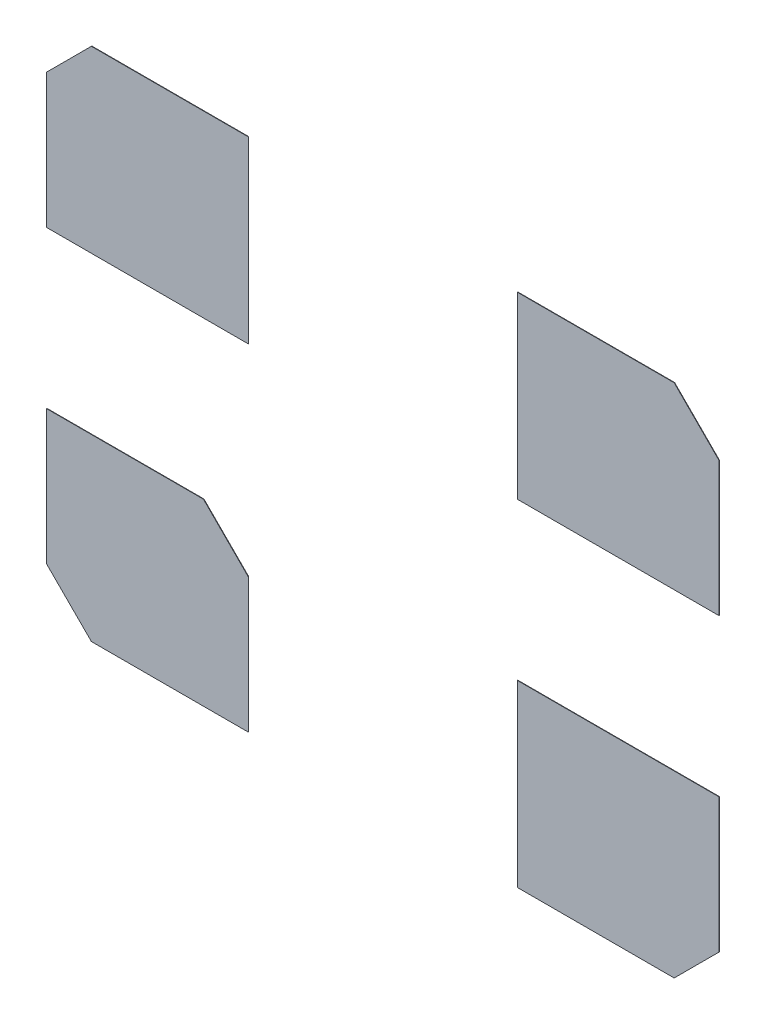
ISO-10303-21;
HEADER;
FILE_DESCRIPTION(('STEP AP214'),'2;1');
FILE_NAME('part.step','',(''),(''),'','','');
FILE_SCHEMA(('AUTOMOTIVE_DESIGN { 1 0 10303 214 1 1 1 1 }'));
ENDSEC;
DATA;
#1=APPLICATION_CONTEXT('core data for automotive mechanical design processes');
#2=APPLICATION_PROTOCOL_DEFINITION('international standard','automotive_design',2000,#1);
#3=PRODUCT_CONTEXT('',#1,'mechanical');
#4=PRODUCT('Part','Part','',(#3));
#5=PRODUCT_RELATED_PRODUCT_CATEGORY('part','',(#4));
#6=PRODUCT_DEFINITION_FORMATION('','',#4);
#7=PRODUCT_DEFINITION_CONTEXT('part definition',#1,'design');
#8=PRODUCT_DEFINITION('design','',#6,#7);
#9=PRODUCT_DEFINITION_SHAPE('','',#8);
#10=(LENGTH_UNIT() NAMED_UNIT(*) SI_UNIT(.MILLI.,.METRE.));
#11=(NAMED_UNIT(*) PLANE_ANGLE_UNIT() SI_UNIT($,.RADIAN.));
#12=(NAMED_UNIT(*) SI_UNIT($,.STERADIAN.) SOLID_ANGLE_UNIT());
#13=UNCERTAINTY_MEASURE_WITH_UNIT(LENGTH_MEASURE(1.E-05),#10,'distance_accuracy_value','');
#14=(GEOMETRIC_REPRESENTATION_CONTEXT(3) GLOBAL_UNCERTAINTY_ASSIGNED_CONTEXT((#13)) GLOBAL_UNIT_ASSIGNED_CONTEXT((#10,
#11,#12)) REPRESENTATION_CONTEXT('',''));
#15=CARTESIAN_POINT('',(0.,0.,0.));
#16=DIRECTION('',(0.,0.,1.));
#17=DIRECTION('',(1.,0.,0.));
#18=AXIS2_PLACEMENT_3D('',#15,#16,#17);
#19=CARTESIAN_POINT('',(0.,0.,0.));
#20=DIRECTION('',(0.,0.,1.));
#21=DIRECTION('',(1.,0.,0.));
#22=AXIS2_PLACEMENT_3D('',#19,#20,#21);
#23=PLANE('',#22);
#24=DIRECTION('',(0.,-1.,0.));
#25=VECTOR('',#24,1.);
#26=CARTESIAN_POINT('',(1.5,-0.475,0.));
#27=LINE('',#26,#25);
#28=CARTESIAN_POINT('',(1.5,-0.35,0.));
#29=VERTEX_POINT('',#28);
#30=CARTESIAN_POINT('',(1.5,-0.95,0.));
#31=VERTEX_POINT('',#30);
#32=EDGE_CURVE('P0_E92',#29,#31,#27,.T.);
#33=ORIENTED_EDGE('',*,*,#32,.T.);
#34=DIRECTION('',(-0.707106781186548,-0.707106781186548,0.));
#35=VECTOR('',#34,1.);
#36=CARTESIAN_POINT('',(1.2625,-1.1875,0.));
#37=LINE('',#36,#35);
#38=CARTESIAN_POINT('',(1.3,-1.15,0.));
#39=VERTEX_POINT('',#38);
#40=EDGE_CURVE('P0_E78',#31,#39,#37,.T.);
#41=ORIENTED_EDGE('',*,*,#40,.T.);
#42=DIRECTION('',(-1.,0.,0.));
#43=VECTOR('',#42,1.);
#44=CARTESIAN_POINT('',(0.3,-1.15,0.));
#45=LINE('',#44,#43);
#46=CARTESIAN_POINT('',(0.6,-1.15,0.));
#47=VERTEX_POINT('',#46);
#48=EDGE_CURVE('P0_E114',#39,#47,#45,.T.);
#49=ORIENTED_EDGE('',*,*,#48,.T.);
#50=DIRECTION('',(0.,1.,0.));
#51=VECTOR('',#50,1.);
#52=CARTESIAN_POINT('',(0.6,-0.175,0.));
#53=LINE('',#52,#51);
#54=CARTESIAN_POINT('',(0.6,-0.35,0.));
#55=VERTEX_POINT('',#54);
#56=EDGE_CURVE('P0_E11',#47,#55,#53,.T.);
#57=ORIENTED_EDGE('',*,*,#56,.T.);
#58=DIRECTION('',(1.,0.,0.));
#59=VECTOR('',#58,1.);
#60=CARTESIAN_POINT('',(1.042803663054,-0.35,0.));
#61=LINE('',#60,#59);
#62=EDGE_CURVE('P0_E20',#55,#29,#61,.T.);
#63=ORIENTED_EDGE('',*,*,#62,.T.);
#64=EDGE_LOOP('',(#33,#41,#49,#57,#63));
#65=FACE_BOUND('',#64,.T.);
#66=ADVANCED_FACE('P0_F17',(#65),#23,.F.);
#67=CARTESIAN_POINT('',(0.6,-0.35,0.));
#68=DIRECTION('',(-1.,0.,0.));
#69=DIRECTION('',(0.,0.,1.));
#70=AXIS2_PLACEMENT_3D('',#67,#68,#69);
#71=PLANE('',#70);
#72=DIRECTION('',(0.,0.,-1.));
#73=VECTOR('',#72,1.);
#74=CARTESIAN_POINT('',(0.6,-1.15,0.));
#75=LINE('',#74,#73);
#76=CARTESIAN_POINT('',(0.6,-1.15,0.002));
#77=VERTEX_POINT('',#76);
#78=EDGE_CURVE('P0_E117',#77,#47,#75,.T.);
#79=ORIENTED_EDGE('',*,*,#78,.F.);
#80=DIRECTION('',(0.,-1.,0.));
#81=VECTOR('',#80,1.);
#82=CARTESIAN_POINT('',(0.6,-0.35,0.002));
#83=LINE('',#82,#81);
#84=CARTESIAN_POINT('',(0.6,-0.35,0.002));
#85=VERTEX_POINT('',#84);
#86=EDGE_CURVE('P0_E136',#85,#77,#83,.T.);
#87=ORIENTED_EDGE('',*,*,#86,.F.);
#88=DIRECTION('',(0.,0.,1.));
#89=VECTOR('',#88,1.);
#90=CARTESIAN_POINT('',(0.6,-0.35,0.));
#91=LINE('',#90,#89);
#92=EDGE_CURVE('P0_E26',#55,#85,#91,.T.);
#93=ORIENTED_EDGE('',*,*,#92,.F.);
#94=ORIENTED_EDGE('',*,*,#56,.F.);
#95=EDGE_LOOP('',(#79,#87,#93,#94));
#96=FACE_BOUND('',#95,.T.);
#97=ADVANCED_FACE('P0_F137',(#96),#71,.T.);
#98=CARTESIAN_POINT('',(2.085607326109,-0.35,0.));
#99=DIRECTION('',(0.,1.,0.));
#100=DIRECTION('',(1.,0.,0.));
#101=AXIS2_PLACEMENT_3D('',#98,#99,#100);
#102=PLANE('',#101);
#103=DIRECTION('',(0.,0.,1.));
#104=VECTOR('',#103,1.);
#105=CARTESIAN_POINT('',(1.5,-0.35,0.));
#106=LINE('',#105,#104);
#107=CARTESIAN_POINT('',(1.5,-0.35,0.002));
#108=VERTEX_POINT('',#107);
#109=EDGE_CURVE('P0_E96',#29,#108,#106,.T.);
#110=ORIENTED_EDGE('',*,*,#109,.F.);
#111=ORIENTED_EDGE('',*,*,#62,.F.);
#112=ORIENTED_EDGE('',*,*,#92,.T.);
#113=DIRECTION('',(-1.,0.,0.));
#114=VECTOR('',#113,1.);
#115=CARTESIAN_POINT('',(2.085607326109,-0.35,0.002));
#116=LINE('',#115,#114);
#117=EDGE_CURVE('P0_E134',#108,#85,#116,.T.);
#118=ORIENTED_EDGE('',*,*,#117,.F.);
#119=EDGE_LOOP('',(#110,#111,#112,#118));
#120=FACE_BOUND('',#119,.T.);
#121=ADVANCED_FACE('P0_F132',(#120),#102,.T.);
#122=CARTESIAN_POINT('',(0.6,-1.15,0.));
#123=DIRECTION('',(0.,-1.,0.));
#124=DIRECTION('',(0.,0.,-1.));
#125=AXIS2_PLACEMENT_3D('',#122,#123,#124);
#126=PLANE('',#125);
#127=ORIENTED_EDGE('',*,*,#48,.F.);
#128=DIRECTION('',(0.,0.,1.));
#129=VECTOR('',#128,1.);
#130=CARTESIAN_POINT('',(1.3,-1.15,0.));
#131=LINE('',#130,#129);
#132=CARTESIAN_POINT('',(1.3,-1.15,0.002));
#133=VERTEX_POINT('',#132);
#134=EDGE_CURVE('P0_E84',#39,#133,#131,.T.);
#135=ORIENTED_EDGE('',*,*,#134,.T.);
#136=DIRECTION('',(-1.,0.,0.));
#137=VECTOR('',#136,1.);
#138=CARTESIAN_POINT('',(0.971401831527,-1.15,0.002));
#139=LINE('',#138,#137);
#140=EDGE_CURVE('P0_E109',#133,#77,#139,.T.);
#141=ORIENTED_EDGE('',*,*,#140,.T.);
#142=ORIENTED_EDGE('',*,*,#78,.T.);
#143=EDGE_LOOP('',(#127,#135,#141,#142));
#144=FACE_BOUND('',#143,.T.);
#145=ADVANCED_FACE('P0_F153',(#144),#126,.T.);
#146=CARTESIAN_POINT('',(1.3,-1.15,0.));
#147=DIRECTION('',(0.707106781186548,-0.707106781186548,0.));
#148=DIRECTION('',(0.,0.,-1.));
#149=AXIS2_PLACEMENT_3D('',#146,#147,#148);
#150=PLANE('',#149);
#151=ORIENTED_EDGE('',*,*,#40,.F.);
#152=DIRECTION('',(0.,0.,1.));
#153=VECTOR('',#152,1.);
#154=CARTESIAN_POINT('',(1.5,-0.95,0.));
#155=LINE('',#154,#153);
#156=CARTESIAN_POINT('',(1.5,-0.95,0.002));
#157=VERTEX_POINT('',#156);
#158=EDGE_CURVE('P0_E82',#31,#157,#155,.T.);
#159=ORIENTED_EDGE('',*,*,#158,.T.);
#160=DIRECTION('',(-0.707106781186548,-0.707106781186548,0.));
#161=VECTOR('',#160,1.);
#162=CARTESIAN_POINT('',(1.385472414715,-1.064527585285,0.002));
#163=LINE('',#162,#161);
#164=EDGE_CURVE('P0_E101',#157,#133,#163,.T.);
#165=ORIENTED_EDGE('',*,*,#164,.T.);
#166=ORIENTED_EDGE('',*,*,#134,.F.);
#167=EDGE_LOOP('',(#151,#159,#165,#166));
#168=FACE_BOUND('',#167,.T.);
#169=ADVANCED_FACE('P0_F80',(#168),#150,.T.);
#170=CARTESIAN_POINT('',(1.5,-0.95,0.));
#171=DIRECTION('',(1.,0.,0.));
#172=DIRECTION('',(0.,1.,0.));
#173=AXIS2_PLACEMENT_3D('',#170,#171,#172);
#174=PLANE('',#173);
#175=ORIENTED_EDGE('',*,*,#32,.F.);
#176=ORIENTED_EDGE('',*,*,#109,.T.);
#177=DIRECTION('',(0.,-1.,0.));
#178=VECTOR('',#177,1.);
#179=CARTESIAN_POINT('',(1.5,-0.900457002096,0.002));
#180=LINE('',#179,#178);
#181=EDGE_CURVE('P0_E94',#108,#157,#180,.T.);
#182=ORIENTED_EDGE('',*,*,#181,.T.);
#183=ORIENTED_EDGE('',*,*,#158,.F.);
#184=EDGE_LOOP('',(#175,#176,#182,#183));
#185=FACE_BOUND('',#184,.T.);
#186=ADVANCED_FACE('P0_F91',(#185),#174,.T.);
#187=CARTESIAN_POINT('',(-0.08604261524792,0.116157523353,0.002));
#188=DIRECTION('',(0.,0.,1.));
#189=DIRECTION('',(1.,0.,0.));
#190=AXIS2_PLACEMENT_3D('',#187,#188,#189);
#191=PLANE('',#190);
#192=ORIENTED_EDGE('',*,*,#181,.F.);
#193=ORIENTED_EDGE('',*,*,#117,.T.);
#194=ORIENTED_EDGE('',*,*,#86,.T.);
#195=ORIENTED_EDGE('',*,*,#140,.F.);
#196=ORIENTED_EDGE('',*,*,#164,.F.);
#197=EDGE_LOOP('',(#192,#193,#194,#195,#196));
#198=FACE_BOUND('',#197,.T.);
#199=ADVANCED_FACE('P0_F142',(#198),#191,.T.);
#200=CLOSED_SHELL('',(#66,#97,#121,#145,#169,#186,#199));
#201=MANIFOLD_SOLID_BREP('P0_B1',#200);
#202=CARTESIAN_POINT('',(-0.08604261524792,0.116157523353,0.002));
#203=DIRECTION('',(0.,0.,1.));
#204=DIRECTION('',(1.,0.,0.));
#205=AXIS2_PLACEMENT_3D('',#202,#203,#204);
#206=PLANE('',#205);
#207=DIRECTION('',(-0.707106781186548,0.707106781186548,0.));
#208=VECTOR('',#207,1.);
#209=CARTESIAN_POINT('',(-0.6375,-0.5125,0.002));
#210=LINE('',#209,#208);
#211=CARTESIAN_POINT('',(-0.6,-0.55,0.002));
#212=VERTEX_POINT('',#211);
#213=CARTESIAN_POINT('',(-0.8,-0.35,0.002));
#214=VERTEX_POINT('',#213);
#215=EDGE_CURVE('P1_E11',#212,#214,#210,.T.);
#216=ORIENTED_EDGE('',*,*,#215,.T.);
#217=DIRECTION('',(1.,0.,0.));
#218=VECTOR('',#217,1.);
#219=CARTESIAN_POINT('',(-1.9178569366,-0.35,0.002));
#220=LINE('',#219,#218);
#221=CARTESIAN_POINT('',(-1.5,-0.35,0.002));
#222=VERTEX_POINT('',#221);
#223=EDGE_CURVE('P1_E26',#222,#214,#220,.T.);
#224=ORIENTED_EDGE('',*,*,#223,.F.);
#225=DIRECTION('',(0.,-1.,0.));
#226=VECTOR('',#225,1.);
#227=CARTESIAN_POINT('',(-1.5,-0.900457002096,0.002));
#228=LINE('',#227,#226);
#229=CARTESIAN_POINT('',(-1.5,-0.95,0.002));
#230=VERTEX_POINT('',#229);
#231=EDGE_CURVE('P1_E129',#222,#230,#228,.T.);
#232=ORIENTED_EDGE('',*,*,#231,.T.);
#233=DIRECTION('',(0.707106781186548,-0.707106781186548,0.));
#234=VECTOR('',#233,1.);
#235=CARTESIAN_POINT('',(-1.385472414715,-1.064527585285,0.002));
#236=LINE('',#235,#234);
#237=CARTESIAN_POINT('',(-1.3,-1.15,0.002));
#238=VERTEX_POINT('',#237);
#239=EDGE_CURVE('P1_E101',#230,#238,#236,.T.);
#240=ORIENTED_EDGE('',*,*,#239,.T.);
#241=DIRECTION('',(1.,0.,0.));
#242=VECTOR('',#241,1.);
#243=CARTESIAN_POINT('',(-0.971401831527,-1.15,0.002));
#244=LINE('',#243,#242);
#245=CARTESIAN_POINT('',(-0.6,-1.15,0.002));
#246=VERTEX_POINT('',#245);
#247=EDGE_CURVE('P1_E104',#238,#246,#244,.T.);
#248=ORIENTED_EDGE('',*,*,#247,.T.);
#249=DIRECTION('',(0.,-1.,0.));
#250=VECTOR('',#249,1.);
#251=CARTESIAN_POINT('',(-0.6,1.53481388375,0.002));
#252=LINE('',#251,#250);
#253=EDGE_CURVE('P1_E150',#212,#246,#252,.T.);
#254=ORIENTED_EDGE('',*,*,#253,.F.);
#255=EDGE_LOOP('',(#216,#224,#232,#240,#248,#254));
#256=FACE_BOUND('',#255,.T.);
#257=ADVANCED_FACE('P1_F17',(#256),#206,.T.);
#258=CARTESIAN_POINT('',(-0.7,-0.45,0.));
#259=DIRECTION('',(0.707106781186548,0.707106781186548,0.));
#260=DIRECTION('',(0.,0.,-1.));
#261=AXIS2_PLACEMENT_3D('',#258,#259,#260);
#262=PLANE('',#261);
#263=DIRECTION('',(-0.707106781186548,0.707106781186548,0.));
#264=VECTOR('',#263,1.);
#265=CARTESIAN_POINT('',(-0.6375,-0.5125,0.));
#266=LINE('',#265,#264);
#267=CARTESIAN_POINT('',(-0.6,-0.55,0.));
#268=VERTEX_POINT('',#267);
#269=CARTESIAN_POINT('',(-0.8,-0.35,0.));
#270=VERTEX_POINT('',#269);
#271=EDGE_CURVE('P1_E128',#268,#270,#266,.T.);
#272=ORIENTED_EDGE('',*,*,#271,.T.);
#273=DIRECTION('',(0.,0.,1.));
#274=VECTOR('',#273,1.);
#275=CARTESIAN_POINT('',(-0.8,-0.35,0.));
#276=LINE('',#275,#274);
#277=EDGE_CURVE('P1_E134',#270,#214,#276,.T.);
#278=ORIENTED_EDGE('',*,*,#277,.T.);
#279=ORIENTED_EDGE('',*,*,#215,.F.);
#280=DIRECTION('',(0.,0.,-1.));
#281=VECTOR('',#280,1.);
#282=CARTESIAN_POINT('',(-0.6,-0.55,0.));
#283=LINE('',#282,#281);
#284=EDGE_CURVE('P1_E146',#212,#268,#283,.T.);
#285=ORIENTED_EDGE('',*,*,#284,.T.);
#286=EDGE_LOOP('',(#272,#278,#279,#285));
#287=FACE_BOUND('',#286,.T.);
#288=ADVANCED_FACE('P1_F171',(#287),#262,.T.);
#289=CARTESIAN_POINT('',(-1.9178569366,-0.35,0.));
#290=DIRECTION('',(0.,-1.,0.));
#291=DIRECTION('',(0.,0.,-1.));
#292=AXIS2_PLACEMENT_3D('',#289,#290,#291);
#293=PLANE('',#292);
#294=ORIENTED_EDGE('',*,*,#277,.F.);
#295=DIRECTION('',(1.,0.,0.));
#296=VECTOR('',#295,1.);
#297=CARTESIAN_POINT('',(-0.9589284683,-0.35,0.));
#298=LINE('',#297,#296);
#299=CARTESIAN_POINT('',(-1.5,-0.35,0.));
#300=VERTEX_POINT('',#299);
#301=EDGE_CURVE('P1_E65',#300,#270,#298,.T.);
#302=ORIENTED_EDGE('',*,*,#301,.F.);
#303=DIRECTION('',(0.,0.,1.));
#304=VECTOR('',#303,1.);
#305=CARTESIAN_POINT('',(-1.5,-0.35,0.));
#306=LINE('',#305,#304);
#307=EDGE_CURVE('P1_E125',#300,#222,#306,.T.);
#308=ORIENTED_EDGE('',*,*,#307,.T.);
#309=ORIENTED_EDGE('',*,*,#223,.T.);
#310=EDGE_LOOP('',(#294,#302,#308,#309));
#311=FACE_BOUND('',#310,.T.);
#312=ADVANCED_FACE('P1_F187',(#311),#293,.F.);
#313=CARTESIAN_POINT('',(0.,0.,0.));
#314=DIRECTION('',(0.,0.,1.));
#315=DIRECTION('',(1.,0.,0.));
#316=AXIS2_PLACEMENT_3D('',#313,#314,#315);
#317=PLANE('',#316);
#318=ORIENTED_EDGE('',*,*,#271,.F.);
#319=DIRECTION('',(0.,-1.,0.));
#320=VECTOR('',#319,1.);
#321=CARTESIAN_POINT('',(-0.6,0.767406941875,0.));
#322=LINE('',#321,#320);
#323=CARTESIAN_POINT('',(-0.6,-1.15,0.));
#324=VERTEX_POINT('',#323);
#325=EDGE_CURVE('P1_E110',#268,#324,#322,.T.);
#326=ORIENTED_EDGE('',*,*,#325,.T.);
#327=DIRECTION('',(-1.,0.,0.));
#328=VECTOR('',#327,1.);
#329=CARTESIAN_POINT('',(-0.3,-1.15,0.));
#330=LINE('',#329,#328);
#331=CARTESIAN_POINT('',(-1.3,-1.15,0.));
#332=VERTEX_POINT('',#331);
#333=EDGE_CURVE('P1_E83',#324,#332,#330,.T.);
#334=ORIENTED_EDGE('',*,*,#333,.T.);
#335=DIRECTION('',(-0.707106781186548,0.707106781186548,0.));
#336=VECTOR('',#335,1.);
#337=CARTESIAN_POINT('',(-1.2625,-1.1875,0.));
#338=LINE('',#337,#336);
#339=CARTESIAN_POINT('',(-1.5,-0.95,0.));
#340=VERTEX_POINT('',#339);
#341=EDGE_CURVE('P1_E91',#332,#340,#338,.T.);
#342=ORIENTED_EDGE('',*,*,#341,.T.);
#343=DIRECTION('',(0.,1.,0.));
#344=VECTOR('',#343,1.);
#345=CARTESIAN_POINT('',(-1.5,-0.475,0.));
#346=LINE('',#345,#344);
#347=EDGE_CURVE('P1_E153',#340,#300,#346,.T.);
#348=ORIENTED_EDGE('',*,*,#347,.T.);
#349=ORIENTED_EDGE('',*,*,#301,.T.);
#350=EDGE_LOOP('',(#318,#326,#334,#342,#348,#349));
#351=FACE_BOUND('',#350,.T.);
#352=ADVANCED_FACE('P1_F108',(#351),#317,.F.);
#353=CARTESIAN_POINT('',(-1.5,-0.95,0.));
#354=DIRECTION('',(1.,0.,0.));
#355=DIRECTION('',(0.,1.,0.));
#356=AXIS2_PLACEMENT_3D('',#353,#354,#355);
#357=PLANE('',#356);
#358=ORIENTED_EDGE('',*,*,#347,.F.);
#359=DIRECTION('',(0.,0.,1.));
#360=VECTOR('',#359,1.);
#361=CARTESIAN_POINT('',(-1.5,-0.95,0.));
#362=LINE('',#361,#360);
#363=EDGE_CURVE('P1_E97',#340,#230,#362,.T.);
#364=ORIENTED_EDGE('',*,*,#363,.T.);
#365=ORIENTED_EDGE('',*,*,#231,.F.);
#366=ORIENTED_EDGE('',*,*,#307,.F.);
#367=EDGE_LOOP('',(#358,#364,#365,#366));
#368=FACE_BOUND('',#367,.T.);
#369=ADVANCED_FACE('P1_F164',(#368),#357,.F.);
#370=CARTESIAN_POINT('',(-1.3,-1.15,0.));
#371=DIRECTION('',(0.707106781186548,0.707106781186548,0.));
#372=DIRECTION('',(0.,0.,-1.));
#373=AXIS2_PLACEMENT_3D('',#370,#371,#372);
#374=PLANE('',#373);
#375=ORIENTED_EDGE('',*,*,#341,.F.);
#376=DIRECTION('',(0.,0.,1.));
#377=VECTOR('',#376,1.);
#378=CARTESIAN_POINT('',(-1.3,-1.15,0.));
#379=LINE('',#378,#377);
#380=EDGE_CURVE('P1_E94',#332,#238,#379,.T.);
#381=ORIENTED_EDGE('',*,*,#380,.T.);
#382=ORIENTED_EDGE('',*,*,#239,.F.);
#383=ORIENTED_EDGE('',*,*,#363,.F.);
#384=EDGE_LOOP('',(#375,#381,#382,#383));
#385=FACE_BOUND('',#384,.T.);
#386=ADVANCED_FACE('P1_F92',(#385),#374,.F.);
#387=CARTESIAN_POINT('',(-0.6,-1.15,0.));
#388=DIRECTION('',(0.,1.,0.));
#389=DIRECTION('',(1.,0.,0.));
#390=AXIS2_PLACEMENT_3D('',#387,#388,#389);
#391=PLANE('',#390);
#392=ORIENTED_EDGE('',*,*,#333,.F.);
#393=DIRECTION('',(0.,0.,-1.));
#394=VECTOR('',#393,1.);
#395=CARTESIAN_POINT('',(-0.6,-1.15,0.));
#396=LINE('',#395,#394);
#397=EDGE_CURVE('P1_E120',#246,#324,#396,.T.);
#398=ORIENTED_EDGE('',*,*,#397,.F.);
#399=ORIENTED_EDGE('',*,*,#247,.F.);
#400=ORIENTED_EDGE('',*,*,#380,.F.);
#401=EDGE_LOOP('',(#392,#398,#399,#400));
#402=FACE_BOUND('',#401,.T.);
#403=ADVANCED_FACE('P1_F103',(#402),#391,.F.);
#404=CARTESIAN_POINT('',(-0.6,1.53481388375,0.));
#405=DIRECTION('',(-1.,0.,0.));
#406=DIRECTION('',(0.,0.,1.));
#407=AXIS2_PLACEMENT_3D('',#404,#405,#406);
#408=PLANE('',#407);
#409=ORIENTED_EDGE('',*,*,#284,.F.);
#410=ORIENTED_EDGE('',*,*,#253,.T.);
#411=ORIENTED_EDGE('',*,*,#397,.T.);
#412=ORIENTED_EDGE('',*,*,#325,.F.);
#413=EDGE_LOOP('',(#409,#410,#411,#412));
#414=FACE_BOUND('',#413,.T.);
#415=ADVANCED_FACE('P1_F169',(#414),#408,.F.);
#416=CLOSED_SHELL('',(#257,#288,#312,#352,#369,#386,#403,#415));
#417=MANIFOLD_SOLID_BREP('P1_B1',#416);
#418=CARTESIAN_POINT('',(-0.6,1.53481388375,0.));
#419=DIRECTION('',(-1.,0.,0.));
#420=DIRECTION('',(0.,0.,1.));
#421=AXIS2_PLACEMENT_3D('',#418,#419,#420);
#422=PLANE('',#421);
#423=DIRECTION('',(0.,0.,1.));
#424=VECTOR('',#423,1.);
#425=CARTESIAN_POINT('',(-0.6,1.15,0.));
#426=LINE('',#425,#424);
#427=CARTESIAN_POINT('',(-0.6,1.15,0.));
#428=VERTEX_POINT('',#427);
#429=CARTESIAN_POINT('',(-0.6,1.15,0.002));
#430=VERTEX_POINT('',#429);
#431=EDGE_CURVE('P2_E86',#428,#430,#426,.T.);
#432=ORIENTED_EDGE('',*,*,#431,.T.);
#433=DIRECTION('',(0.,-1.,0.));
#434=VECTOR('',#433,1.);
#435=CARTESIAN_POINT('',(-0.6,1.53481388375,0.002));
#436=LINE('',#435,#434);
#437=CARTESIAN_POINT('',(-0.6,0.35,0.002));
#438=VERTEX_POINT('',#437);
#439=EDGE_CURVE('P2_E85',#430,#438,#436,.T.);
#440=ORIENTED_EDGE('',*,*,#439,.T.);
#441=DIRECTION('',(0.,0.,-1.));
#442=VECTOR('',#441,1.);
#443=CARTESIAN_POINT('',(-0.6,0.35,0.));
#444=LINE('',#443,#442);
#445=CARTESIAN_POINT('',(-0.6,0.35,0.));
#446=VERTEX_POINT('',#445);
#447=EDGE_CURVE('P2_E25',#438,#446,#444,.T.);
#448=ORIENTED_EDGE('',*,*,#447,.T.);
#449=DIRECTION('',(0.,-1.,0.));
#450=VECTOR('',#449,1.);
#451=CARTESIAN_POINT('',(-0.6,0.767406941875,0.));
#452=LINE('',#451,#450);
#453=EDGE_CURVE('P2_E11',#428,#446,#452,.T.);
#454=ORIENTED_EDGE('',*,*,#453,.F.);
#455=EDGE_LOOP('',(#432,#440,#448,#454));
#456=FACE_BOUND('',#455,.T.);
#457=ADVANCED_FACE('P2_F17',(#456),#422,.F.);
#458=CARTESIAN_POINT('',(0.,0.,0.));
#459=DIRECTION('',(0.,0.,1.));
#460=DIRECTION('',(1.,0.,0.));
#461=AXIS2_PLACEMENT_3D('',#458,#459,#460);
#462=PLANE('',#461);
#463=DIRECTION('',(0.,1.,0.));
#464=VECTOR('',#463,1.);
#465=CARTESIAN_POINT('',(-1.5,0.475,0.));
#466=LINE('',#465,#464);
#467=CARTESIAN_POINT('',(-1.5,0.35,0.));
#468=VERTEX_POINT('',#467);
#469=CARTESIAN_POINT('',(-1.5,0.95,0.));
#470=VERTEX_POINT('',#469);
#471=EDGE_CURVE('P2_E118',#468,#470,#466,.T.);
#472=ORIENTED_EDGE('',*,*,#471,.T.);
#473=DIRECTION('',(0.707106781186548,0.707106781186548,0.));
#474=VECTOR('',#473,1.);
#475=CARTESIAN_POINT('',(-1.2625,1.1875,0.));
#476=LINE('',#475,#474);
#477=CARTESIAN_POINT('',(-1.3,1.15,0.));
#478=VERTEX_POINT('',#477);
#479=EDGE_CURVE('P2_E106',#470,#478,#476,.T.);
#480=ORIENTED_EDGE('',*,*,#479,.T.);
#481=DIRECTION('',(1.,0.,0.));
#482=VECTOR('',#481,1.);
#483=CARTESIAN_POINT('',(-0.3,1.15,0.));
#484=LINE('',#483,#482);
#485=EDGE_CURVE('P2_E127',#478,#428,#484,.T.);
#486=ORIENTED_EDGE('',*,*,#485,.T.);
#487=ORIENTED_EDGE('',*,*,#453,.T.);
#488=DIRECTION('',(-1.,0.,0.));
#489=VECTOR('',#488,1.);
#490=CARTESIAN_POINT('',(0.9589284683,0.35,0.));
#491=LINE('',#490,#489);
#492=EDGE_CURVE('P2_E82',#446,#468,#491,.T.);
#493=ORIENTED_EDGE('',*,*,#492,.T.);
#494=EDGE_LOOP('',(#472,#480,#486,#487,#493));
#495=FACE_BOUND('',#494,.T.);
#496=ADVANCED_FACE('P2_F135',(#495),#462,.F.);
#497=CARTESIAN_POINT('',(1.9178569366,0.35,0.));
#498=DIRECTION('',(0.,1.,0.));
#499=DIRECTION('',(1.,0.,0.));
#500=AXIS2_PLACEMENT_3D('',#497,#498,#499);
#501=PLANE('',#500);
#502=DIRECTION('',(0.,0.,-1.));
#503=VECTOR('',#502,1.);
#504=CARTESIAN_POINT('',(-1.5,0.35,0.));
#505=LINE('',#504,#503);
#506=CARTESIAN_POINT('',(-1.5,0.35,0.002));
#507=VERTEX_POINT('',#506);
#508=EDGE_CURVE('P2_E122',#507,#468,#505,.T.);
#509=ORIENTED_EDGE('',*,*,#508,.T.);
#510=ORIENTED_EDGE('',*,*,#492,.F.);
#511=ORIENTED_EDGE('',*,*,#447,.F.);
#512=DIRECTION('',(-1.,0.,0.));
#513=VECTOR('',#512,1.);
#514=CARTESIAN_POINT('',(1.9178569366,0.35,0.002));
#515=LINE('',#514,#513);
#516=EDGE_CURVE('P2_E80',#438,#507,#515,.T.);
#517=ORIENTED_EDGE('',*,*,#516,.T.);
#518=EDGE_LOOP('',(#509,#510,#511,#517));
#519=FACE_BOUND('',#518,.T.);
#520=ADVANCED_FACE('P2_F78',(#519),#501,.F.);
#521=CARTESIAN_POINT('',(-0.6,1.15,0.));
#522=DIRECTION('',(0.,1.,0.));
#523=DIRECTION('',(1.,0.,0.));
#524=AXIS2_PLACEMENT_3D('',#521,#522,#523);
#525=PLANE('',#524);
#526=ORIENTED_EDGE('',*,*,#485,.F.);
#527=DIRECTION('',(0.,0.,1.));
#528=VECTOR('',#527,1.);
#529=CARTESIAN_POINT('',(-1.3,1.15,0.));
#530=LINE('',#529,#528);
#531=CARTESIAN_POINT('',(-1.3,1.15,0.002));
#532=VERTEX_POINT('',#531);
#533=EDGE_CURVE('P2_E110',#478,#532,#530,.T.);
#534=ORIENTED_EDGE('',*,*,#533,.T.);
#535=DIRECTION('',(1.,0.,0.));
#536=VECTOR('',#535,1.);
#537=CARTESIAN_POINT('',(-0.971401831527,1.15,0.002));
#538=LINE('',#537,#536);
#539=EDGE_CURVE('P2_E91',#532,#430,#538,.T.);
#540=ORIENTED_EDGE('',*,*,#539,.T.);
#541=ORIENTED_EDGE('',*,*,#431,.F.);
#542=EDGE_LOOP('',(#526,#534,#540,#541));
#543=FACE_BOUND('',#542,.T.);
#544=ADVANCED_FACE('P2_F144',(#543),#525,.T.);
#545=CARTESIAN_POINT('',(-1.3,1.15,0.));
#546=DIRECTION('',(-0.707106781186548,0.707106781186548,0.));
#547=DIRECTION('',(0.,0.,1.));
#548=AXIS2_PLACEMENT_3D('',#545,#546,#547);
#549=PLANE('',#548);
#550=ORIENTED_EDGE('',*,*,#479,.F.);
#551=DIRECTION('',(0.,0.,1.));
#552=VECTOR('',#551,1.);
#553=CARTESIAN_POINT('',(-1.5,0.95,0.));
#554=LINE('',#553,#552);
#555=CARTESIAN_POINT('',(-1.5,0.95,0.002));
#556=VERTEX_POINT('',#555);
#557=EDGE_CURVE('P2_E111',#470,#556,#554,.T.);
#558=ORIENTED_EDGE('',*,*,#557,.T.);
#559=DIRECTION('',(0.707106781186548,0.707106781186548,0.));
#560=VECTOR('',#559,1.);
#561=CARTESIAN_POINT('',(-1.385472414715,1.064527585285,0.002));
#562=LINE('',#561,#560);
#563=EDGE_CURVE('P2_E113',#556,#532,#562,.T.);
#564=ORIENTED_EDGE('',*,*,#563,.T.);
#565=ORIENTED_EDGE('',*,*,#533,.F.);
#566=EDGE_LOOP('',(#550,#558,#564,#565));
#567=FACE_BOUND('',#566,.T.);
#568=ADVANCED_FACE('P2_F141',(#567),#549,.T.);
#569=CARTESIAN_POINT('',(-1.5,0.95,0.));
#570=DIRECTION('',(-1.,0.,0.));
#571=DIRECTION('',(0.,0.,1.));
#572=AXIS2_PLACEMENT_3D('',#569,#570,#571);
#573=PLANE('',#572);
#574=ORIENTED_EDGE('',*,*,#471,.F.);
#575=ORIENTED_EDGE('',*,*,#508,.F.);
#576=DIRECTION('',(0.,1.,0.));
#577=VECTOR('',#576,1.);
#578=CARTESIAN_POINT('',(-1.5,0.900457002096,0.002));
#579=LINE('',#578,#577);
#580=EDGE_CURVE('P2_E96',#507,#556,#579,.T.);
#581=ORIENTED_EDGE('',*,*,#580,.T.);
#582=ORIENTED_EDGE('',*,*,#557,.F.);
#583=EDGE_LOOP('',(#574,#575,#581,#582));
#584=FACE_BOUND('',#583,.T.);
#585=ADVANCED_FACE('P2_F139',(#584),#573,.T.);
#586=CARTESIAN_POINT('',(-0.08604261524792,0.116157523353,0.002));
#587=DIRECTION('',(0.,0.,1.));
#588=DIRECTION('',(1.,0.,0.));
#589=AXIS2_PLACEMENT_3D('',#586,#587,#588);
#590=PLANE('',#589);
#591=ORIENTED_EDGE('',*,*,#580,.F.);
#592=ORIENTED_EDGE('',*,*,#516,.F.);
#593=ORIENTED_EDGE('',*,*,#439,.F.);
#594=ORIENTED_EDGE('',*,*,#539,.F.);
#595=ORIENTED_EDGE('',*,*,#563,.F.);
#596=EDGE_LOOP('',(#591,#592,#593,#594,#595));
#597=FACE_BOUND('',#596,.T.);
#598=ADVANCED_FACE('P2_F93',(#597),#590,.T.);
#599=CLOSED_SHELL('',(#457,#496,#520,#544,#568,#585,#598));
#600=MANIFOLD_SOLID_BREP('P2_B1',#599);
#601=CARTESIAN_POINT('',(-0.08604261524792,0.116157523353,0.002));
#602=DIRECTION('',(0.,0.,1.));
#603=DIRECTION('',(1.,0.,0.));
#604=AXIS2_PLACEMENT_3D('',#601,#602,#603);
#605=PLANE('',#604);
#606=DIRECTION('',(0.,1.,0.));
#607=VECTOR('',#606,1.);
#608=CARTESIAN_POINT('',(1.5,0.900457002096,0.002));
#609=LINE('',#608,#607);
#610=CARTESIAN_POINT('',(1.5,0.35,0.002));
#611=VERTEX_POINT('',#610);
#612=CARTESIAN_POINT('',(1.5,0.95,0.002));
#613=VERTEX_POINT('',#612);
#614=EDGE_CURVE('P3_E11',#611,#613,#609,.T.);
#615=ORIENTED_EDGE('',*,*,#614,.T.);
#616=DIRECTION('',(-0.707106781186548,0.707106781186548,0.));
#617=VECTOR('',#616,1.);
#618=CARTESIAN_POINT('',(1.385472414715,1.064527585285,0.002));
#619=LINE('',#618,#617);
#620=CARTESIAN_POINT('',(1.3,1.15,0.002));
#621=VERTEX_POINT('',#620);
#622=EDGE_CURVE('P3_E20',#613,#621,#619,.T.);
#623=ORIENTED_EDGE('',*,*,#622,.T.);
#624=DIRECTION('',(-1.,0.,0.));
#625=VECTOR('',#624,1.);
#626=CARTESIAN_POINT('',(0.971401831527,1.15,0.002));
#627=LINE('',#626,#625);
#628=CARTESIAN_POINT('',(0.6,1.15,0.002));
#629=VERTEX_POINT('',#628);
#630=EDGE_CURVE('P3_E93',#621,#629,#627,.T.);
#631=ORIENTED_EDGE('',*,*,#630,.T.);
#632=DIRECTION('',(0.,1.,0.));
#633=VECTOR('',#632,1.);
#634=CARTESIAN_POINT('',(0.6,-1.53481388375,0.002));
#635=LINE('',#634,#633);
#636=CARTESIAN_POINT('',(0.6,0.35,0.002));
#637=VERTEX_POINT('',#636);
#638=EDGE_CURVE('P3_E94',#637,#629,#635,.T.);
#639=ORIENTED_EDGE('',*,*,#638,.F.);
#640=DIRECTION('',(-1.,0.,0.));
#641=VECTOR('',#640,1.);
#642=CARTESIAN_POINT('',(1.9178569366,0.35,0.002));
#643=LINE('',#642,#641);
#644=EDGE_CURVE('P3_E98',#611,#637,#643,.T.);
#645=ORIENTED_EDGE('',*,*,#644,.F.);
#646=EDGE_LOOP('',(#615,#623,#631,#639,#645));
#647=FACE_BOUND('',#646,.T.);
#648=ADVANCED_FACE('P3_F17',(#647),#605,.T.);
#649=CARTESIAN_POINT('',(1.5,0.95,0.));
#650=DIRECTION('',(-1.,0.,0.));
#651=DIRECTION('',(0.,0.,1.));
#652=AXIS2_PLACEMENT_3D('',#649,#650,#651);
#653=PLANE('',#652);
#654=DIRECTION('',(0.,-1.,0.));
#655=VECTOR('',#654,1.);
#656=CARTESIAN_POINT('',(1.5,0.475,0.));
#657=LINE('',#656,#655);
#658=CARTESIAN_POINT('',(1.5,0.95,0.));
#659=VERTEX_POINT('',#658);
#660=CARTESIAN_POINT('',(1.5,0.35,0.));
#661=VERTEX_POINT('',#660);
#662=EDGE_CURVE('P3_E142',#659,#661,#657,.T.);
#663=ORIENTED_EDGE('',*,*,#662,.F.);
#664=DIRECTION('',(0.,0.,1.));
#665=VECTOR('',#664,1.);
#666=CARTESIAN_POINT('',(1.5,0.95,0.));
#667=LINE('',#666,#665);
#668=EDGE_CURVE('P3_E26',#659,#613,#667,.T.);
#669=ORIENTED_EDGE('',*,*,#668,.T.);
#670=ORIENTED_EDGE('',*,*,#614,.F.);
#671=DIRECTION('',(0.,0.,1.));
#672=VECTOR('',#671,1.);
#673=CARTESIAN_POINT('',(1.5,0.35,0.));
#674=LINE('',#673,#672);
#675=EDGE_CURVE('P3_E85',#661,#611,#674,.T.);
#676=ORIENTED_EDGE('',*,*,#675,.F.);
#677=EDGE_LOOP('',(#663,#669,#670,#676));
#678=FACE_BOUND('',#677,.T.);
#679=ADVANCED_FACE('P3_F151',(#678),#653,.F.);
#680=CARTESIAN_POINT('',(1.3,1.15,0.));
#681=DIRECTION('',(-0.707106781186548,-0.707106781186548,0.));
#682=DIRECTION('',(-0.707106781186548,0.707106781186548,0.));
#683=AXIS2_PLACEMENT_3D('',#680,#681,#682);
#684=PLANE('',#683);
#685=DIRECTION('',(0.707106781186548,-0.707106781186548,0.));
#686=VECTOR('',#685,1.);
#687=CARTESIAN_POINT('',(1.2625,1.1875,0.));
#688=LINE('',#687,#686);
#689=CARTESIAN_POINT('',(1.3,1.15,0.));
#690=VERTEX_POINT('',#689);
#691=EDGE_CURVE('P3_E108',#690,#659,#688,.T.);
#692=ORIENTED_EDGE('',*,*,#691,.F.);
#693=DIRECTION('',(0.,0.,1.));
#694=VECTOR('',#693,1.);
#695=CARTESIAN_POINT('',(1.3,1.15,0.));
#696=LINE('',#695,#694);
#697=EDGE_CURVE('P3_E97',#690,#621,#696,.T.);
#698=ORIENTED_EDGE('',*,*,#697,.T.);
#699=ORIENTED_EDGE('',*,*,#622,.F.);
#700=ORIENTED_EDGE('',*,*,#668,.F.);
#701=EDGE_LOOP('',(#692,#698,#699,#700));
#702=FACE_BOUND('',#701,.T.);
#703=ADVANCED_FACE('P3_F153',(#702),#684,.F.);
#704=CARTESIAN_POINT('',(0.6,1.15,0.));
#705=DIRECTION('',(0.,-1.,0.));
#706=DIRECTION('',(0.,0.,-1.));
#707=AXIS2_PLACEMENT_3D('',#704,#705,#706);
#708=PLANE('',#707);
#709=DIRECTION('',(1.,0.,0.));
#710=VECTOR('',#709,1.);
#711=CARTESIAN_POINT('',(0.3,1.15,0.));
#712=LINE('',#711,#710);
#713=CARTESIAN_POINT('',(0.6,1.15,0.));
#714=VERTEX_POINT('',#713);
#715=EDGE_CURVE('P3_E105',#714,#690,#712,.T.);
#716=ORIENTED_EDGE('',*,*,#715,.F.);
#717=DIRECTION('',(0.,0.,-1.));
#718=VECTOR('',#717,1.);
#719=CARTESIAN_POINT('',(0.6,1.15,0.));
#720=LINE('',#719,#718);
#721=EDGE_CURVE('P3_E61',#629,#714,#720,.T.);
#722=ORIENTED_EDGE('',*,*,#721,.F.);
#723=ORIENTED_EDGE('',*,*,#630,.F.);
#724=ORIENTED_EDGE('',*,*,#697,.F.);
#725=EDGE_LOOP('',(#716,#722,#723,#724));
#726=FACE_BOUND('',#725,.T.);
#727=ADVANCED_FACE('P3_F103',(#726),#708,.F.);
#728=CARTESIAN_POINT('',(1.9178569366,0.35,0.));
#729=DIRECTION('',(0.,1.,0.));
#730=DIRECTION('',(1.,0.,0.));
#731=AXIS2_PLACEMENT_3D('',#728,#729,#730);
#732=PLANE('',#731);
#733=ORIENTED_EDGE('',*,*,#675,.T.);
#734=ORIENTED_EDGE('',*,*,#644,.T.);
#735=DIRECTION('',(0.,0.,1.));
#736=VECTOR('',#735,1.);
#737=CARTESIAN_POINT('',(0.6,0.35,0.));
#738=LINE('',#737,#736);
#739=CARTESIAN_POINT('',(0.6,0.35,0.));
#740=VERTEX_POINT('',#739);
#741=EDGE_CURVE('P3_E75',#740,#637,#738,.T.);
#742=ORIENTED_EDGE('',*,*,#741,.F.);
#743=DIRECTION('',(-1.,0.,0.));
#744=VECTOR('',#743,1.);
#745=CARTESIAN_POINT('',(0.9589284683,0.35,0.));
#746=LINE('',#745,#744);
#747=EDGE_CURVE('P3_E138',#661,#740,#746,.T.);
#748=ORIENTED_EDGE('',*,*,#747,.F.);
#749=EDGE_LOOP('',(#733,#734,#742,#748));
#750=FACE_BOUND('',#749,.T.);
#751=ADVANCED_FACE('P3_F163',(#750),#732,.F.);
#752=CARTESIAN_POINT('',(0.6,-0.35,0.));
#753=DIRECTION('',(1.,0.,0.));
#754=DIRECTION('',(0.,1.,0.));
#755=AXIS2_PLACEMENT_3D('',#752,#753,#754);
#756=PLANE('',#755);
#757=ORIENTED_EDGE('',*,*,#721,.T.);
#758=DIRECTION('',(0.,1.,0.));
#759=VECTOR('',#758,1.);
#760=CARTESIAN_POINT('',(0.6,-0.175,0.));
#761=LINE('',#760,#759);
#762=EDGE_CURVE('P3_E137',#740,#714,#761,.T.);
#763=ORIENTED_EDGE('',*,*,#762,.F.);
#764=ORIENTED_EDGE('',*,*,#741,.T.);
#765=ORIENTED_EDGE('',*,*,#638,.T.);
#766=EDGE_LOOP('',(#757,#763,#764,#765));
#767=FACE_BOUND('',#766,.T.);
#768=ADVANCED_FACE('P3_F100',(#767),#756,.F.);
#769=CARTESIAN_POINT('',(0.,0.,0.));
#770=DIRECTION('',(0.,0.,1.));
#771=DIRECTION('',(1.,0.,0.));
#772=AXIS2_PLACEMENT_3D('',#769,#770,#771);
#773=PLANE('',#772);
#774=ORIENTED_EDGE('',*,*,#662,.T.);
#775=ORIENTED_EDGE('',*,*,#747,.T.);
#776=ORIENTED_EDGE('',*,*,#762,.T.);
#777=ORIENTED_EDGE('',*,*,#715,.T.);
#778=ORIENTED_EDGE('',*,*,#691,.T.);
#779=EDGE_LOOP('',(#774,#775,#776,#777,#778));
#780=FACE_BOUND('',#779,.T.);
#781=ADVANCED_FACE('P3_F150',(#780),#773,.F.);
#782=CLOSED_SHELL('',(#648,#679,#703,#727,#751,#768,#781));
#783=MANIFOLD_SOLID_BREP('P3_B1',#782);
#784=ADVANCED_BREP_SHAPE_REPRESENTATION('',(#18,#201,#417,#600,#783),#14);
#785=SHAPE_DEFINITION_REPRESENTATION(#9,#784);
ENDSEC;
END-ISO-10303-21;
